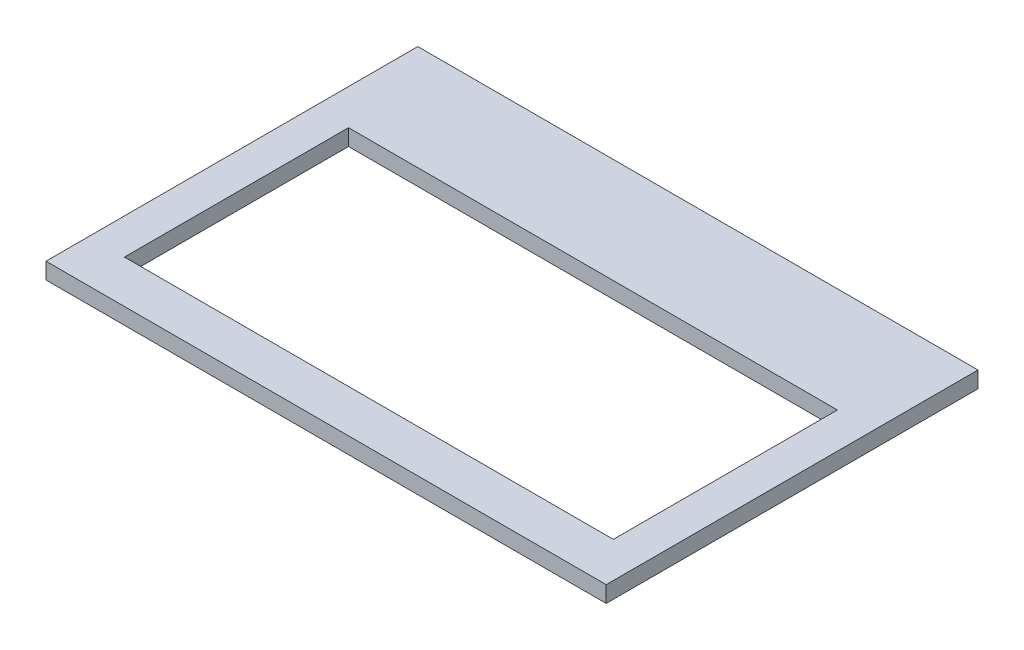
ISO-10303-21;
HEADER;
FILE_DESCRIPTION(('STEP AP214'),'2;1');
FILE_NAME('part.step','',(''),(''),'','','');
FILE_SCHEMA(('AUTOMOTIVE_DESIGN { 1 0 10303 214 1 1 1 1 }'));
ENDSEC;
DATA;
#1=APPLICATION_CONTEXT('core data for automotive mechanical design processes');
#2=APPLICATION_PROTOCOL_DEFINITION('international standard','automotive_design',2000,#1);
#3=PRODUCT_CONTEXT('',#1,'mechanical');
#4=PRODUCT('Part','Part','',(#3));
#5=PRODUCT_RELATED_PRODUCT_CATEGORY('part','',(#4));
#6=PRODUCT_DEFINITION_FORMATION('','',#4);
#7=PRODUCT_DEFINITION_CONTEXT('part definition',#1,'design');
#8=PRODUCT_DEFINITION('design','',#6,#7);
#9=PRODUCT_DEFINITION_SHAPE('','',#8);
#10=(LENGTH_UNIT() NAMED_UNIT(*) SI_UNIT(.MILLI.,.METRE.));
#11=(NAMED_UNIT(*) PLANE_ANGLE_UNIT() SI_UNIT($,.RADIAN.));
#12=(NAMED_UNIT(*) SI_UNIT($,.STERADIAN.) SOLID_ANGLE_UNIT());
#13=UNCERTAINTY_MEASURE_WITH_UNIT(LENGTH_MEASURE(1.E-05),#10,'distance_accuracy_value','');
#14=(GEOMETRIC_REPRESENTATION_CONTEXT(3) GLOBAL_UNCERTAINTY_ASSIGNED_CONTEXT((#13)) GLOBAL_UNIT_ASSIGNED_CONTEXT((#10,
#11,#12)) REPRESENTATION_CONTEXT('',''));
#15=CARTESIAN_POINT('',(0.,0.,0.));
#16=DIRECTION('',(0.,0.,1.));
#17=DIRECTION('',(1.,0.,0.));
#18=AXIS2_PLACEMENT_3D('',#15,#16,#17);
#19=CARTESIAN_POINT('',(275.,16.,182.5));
#20=DIRECTION('',(-1.,0.,0.));
#21=DIRECTION('',(0.,0.,1.));
#22=AXIS2_PLACEMENT_3D('',#19,#20,#21);
#23=PLANE('',#22);
#24=DIRECTION('',(0.,0.,-1.));
#25=VECTOR('',#24,1.);
#26=CARTESIAN_POINT('',(275.,0.,182.5));
#27=LINE('',#26,#25);
#28=CARTESIAN_POINT('',(275.,0.,182.5));
#29=VERTEX_POINT('',#28);
#30=CARTESIAN_POINT('',(275.,0.,-182.5));
#31=VERTEX_POINT('',#30);
#32=EDGE_CURVE('E129',#29,#31,#27,.T.);
#33=ORIENTED_EDGE('',*,*,#32,.T.);
#34=DIRECTION('',(0.,-1.,0.));
#35=VECTOR('',#34,1.);
#36=CARTESIAN_POINT('',(275.,16.,-182.5));
#37=LINE('',#36,#35);
#38=CARTESIAN_POINT('',(275.,16.,-182.5));
#39=VERTEX_POINT('',#38);
#40=EDGE_CURVE('E11',#39,#31,#37,.T.);
#41=ORIENTED_EDGE('',*,*,#40,.F.);
#42=DIRECTION('',(0.,0.,-1.));
#43=VECTOR('',#42,1.);
#44=CARTESIAN_POINT('',(275.,16.,182.5));
#45=LINE('',#44,#43);
#46=CARTESIAN_POINT('',(275.,16.,182.5));
#47=VERTEX_POINT('',#46);
#48=EDGE_CURVE('E133',#47,#39,#45,.T.);
#49=ORIENTED_EDGE('',*,*,#48,.F.);
#50=DIRECTION('',(0.,-1.,0.));
#51=VECTOR('',#50,1.);
#52=CARTESIAN_POINT('',(275.,16.,182.5));
#53=LINE('',#52,#51);
#54=EDGE_CURVE('E143',#47,#29,#53,.T.);
#55=ORIENTED_EDGE('',*,*,#54,.T.);
#56=EDGE_LOOP('',(#33,#41,#49,#55));
#57=FACE_BOUND('',#56,.T.);
#58=ADVANCED_FACE('F32',(#57),#23,.F.);
#59=CARTESIAN_POINT('',(-275.,16.,-182.5));
#60=DIRECTION('',(0.,0.,1.));
#61=DIRECTION('',(1.,0.,0.));
#62=AXIS2_PLACEMENT_3D('',#59,#60,#61);
#63=PLANE('',#62);
#64=DIRECTION('',(-1.,0.,0.));
#65=VECTOR('',#64,1.);
#66=CARTESIAN_POINT('',(-275.,0.,-182.5));
#67=LINE('',#66,#65);
#68=CARTESIAN_POINT('',(-275.,0.,-182.5));
#69=VERTEX_POINT('',#68);
#70=EDGE_CURVE('E146',#31,#69,#67,.T.);
#71=ORIENTED_EDGE('',*,*,#70,.T.);
#72=DIRECTION('',(0.,-1.,0.));
#73=VECTOR('',#72,1.);
#74=CARTESIAN_POINT('',(-275.,16.,-182.5));
#75=LINE('',#74,#73);
#76=CARTESIAN_POINT('',(-275.,16.,-182.5));
#77=VERTEX_POINT('',#76);
#78=EDGE_CURVE('E39',#77,#69,#75,.T.);
#79=ORIENTED_EDGE('',*,*,#78,.F.);
#80=DIRECTION('',(-1.,0.,0.));
#81=VECTOR('',#80,1.);
#82=CARTESIAN_POINT('',(-275.,16.,-182.5));
#83=LINE('',#82,#81);
#84=EDGE_CURVE('E136',#39,#77,#83,.T.);
#85=ORIENTED_EDGE('',*,*,#84,.F.);
#86=ORIENTED_EDGE('',*,*,#40,.T.);
#87=EDGE_LOOP('',(#71,#79,#85,#86));
#88=FACE_BOUND('',#87,.T.);
#89=ADVANCED_FACE('F174',(#88),#63,.F.);
#90=CARTESIAN_POINT('',(-275.,16.,182.5));
#91=DIRECTION('',(1.,0.,0.));
#92=DIRECTION('',(0.,0.,-1.));
#93=AXIS2_PLACEMENT_3D('',#90,#91,#92);
#94=PLANE('',#93);
#95=DIRECTION('',(0.,0.,1.));
#96=VECTOR('',#95,1.);
#97=CARTESIAN_POINT('',(-275.,0.,182.5));
#98=LINE('',#97,#96);
#99=CARTESIAN_POINT('',(-275.,0.,182.5));
#100=VERTEX_POINT('',#99);
#101=EDGE_CURVE('E148',#69,#100,#98,.T.);
#102=ORIENTED_EDGE('',*,*,#101,.T.);
#103=DIRECTION('',(0.,-1.,0.));
#104=VECTOR('',#103,1.);
#105=CARTESIAN_POINT('',(-275.,16.,182.5));
#106=LINE('',#105,#104);
#107=CARTESIAN_POINT('',(-275.,16.,182.5));
#108=VERTEX_POINT('',#107);
#109=EDGE_CURVE('E153',#108,#100,#106,.T.);
#110=ORIENTED_EDGE('',*,*,#109,.F.);
#111=DIRECTION('',(0.,0.,1.));
#112=VECTOR('',#111,1.);
#113=CARTESIAN_POINT('',(-275.,16.,182.5));
#114=LINE('',#113,#112);
#115=EDGE_CURVE('E139',#77,#108,#114,.T.);
#116=ORIENTED_EDGE('',*,*,#115,.F.);
#117=ORIENTED_EDGE('',*,*,#78,.T.);
#118=EDGE_LOOP('',(#102,#110,#116,#117));
#119=FACE_BOUND('',#118,.T.);
#120=ADVANCED_FACE('F160',(#119),#94,.F.);
#121=CARTESIAN_POINT('',(-275.,16.,182.5));
#122=DIRECTION('',(0.,0.,-1.));
#123=DIRECTION('',(-1.,0.,0.));
#124=AXIS2_PLACEMENT_3D('',#121,#122,#123);
#125=PLANE('',#124);
#126=DIRECTION('',(1.,0.,0.));
#127=VECTOR('',#126,1.);
#128=CARTESIAN_POINT('',(-275.,0.,182.5));
#129=LINE('',#128,#127);
#130=EDGE_CURVE('E137',#100,#29,#129,.T.);
#131=ORIENTED_EDGE('',*,*,#130,.T.);
#132=ORIENTED_EDGE('',*,*,#54,.F.);
#133=DIRECTION('',(1.,0.,0.));
#134=VECTOR('',#133,1.);
#135=CARTESIAN_POINT('',(-275.,16.,182.5));
#136=LINE('',#135,#134);
#137=EDGE_CURVE('E141',#108,#47,#136,.T.);
#138=ORIENTED_EDGE('',*,*,#137,.F.);
#139=ORIENTED_EDGE('',*,*,#109,.T.);
#140=EDGE_LOOP('',(#131,#132,#138,#139));
#141=FACE_BOUND('',#140,.T.);
#142=ADVANCED_FACE('F167',(#141),#125,.F.);
#143=CARTESIAN_POINT('',(0.,16.,0.));
#144=DIRECTION('',(0.,-1.,0.));
#145=DIRECTION('',(0.,0.,-1.));
#146=AXIS2_PLACEMENT_3D('',#143,#144,#145);
#147=PLANE('',#146);
#148=DIRECTION('',(1.,0.,0.));
#149=VECTOR('',#148,1.);
#150=CARTESIAN_POINT('',(-240.,16.,140.5));
#151=LINE('',#150,#149);
#152=CARTESIAN_POINT('',(-240.,16.,140.5));
#153=VERTEX_POINT('',#152);
#154=CARTESIAN_POINT('',(240.,16.,140.5));
#155=VERTEX_POINT('',#154);
#156=EDGE_CURVE('E123',#153,#155,#151,.T.);
#157=ORIENTED_EDGE('',*,*,#156,.F.);
#158=DIRECTION('',(0.,0.,1.));
#159=VECTOR('',#158,1.);
#160=CARTESIAN_POINT('',(-240.,16.,-79.4999999999997));
#161=LINE('',#160,#159);
#162=CARTESIAN_POINT('',(-240.,16.,-79.4999999999997));
#163=VERTEX_POINT('',#162);
#164=EDGE_CURVE('E46',#163,#153,#161,.T.);
#165=ORIENTED_EDGE('',*,*,#164,.F.);
#166=DIRECTION('',(-1.,0.,0.));
#167=VECTOR('',#166,1.);
#168=CARTESIAN_POINT('',(-240.,16.,-79.4999999999997));
#169=LINE('',#168,#167);
#170=CARTESIAN_POINT('',(240.,16.,-79.5));
#171=VERTEX_POINT('',#170);
#172=EDGE_CURVE('E114',#171,#163,#169,.T.);
#173=ORIENTED_EDGE('',*,*,#172,.F.);
#174=DIRECTION('',(0.,0.,-1.));
#175=VECTOR('',#174,1.);
#176=CARTESIAN_POINT('',(240.,16.,-79.5));
#177=LINE('',#176,#175);
#178=EDGE_CURVE('E117',#155,#171,#177,.T.);
#179=ORIENTED_EDGE('',*,*,#178,.F.);
#180=EDGE_LOOP('',(#157,#165,#173,#179));
#181=FACE_BOUND('',#180,.T.);
#182=ORIENTED_EDGE('',*,*,#48,.T.);
#183=ORIENTED_EDGE('',*,*,#84,.T.);
#184=ORIENTED_EDGE('',*,*,#115,.T.);
#185=ORIENTED_EDGE('',*,*,#137,.T.);
#186=EDGE_LOOP('',(#182,#183,#184,#185));
#187=FACE_BOUND('',#186,.T.);
#188=ADVANCED_FACE('F173',(#181,#187),#147,.F.);
#189=CARTESIAN_POINT('',(0.,0.,0.));
#190=DIRECTION('',(0.,-1.,0.));
#191=DIRECTION('',(0.,0.,-1.));
#192=AXIS2_PLACEMENT_3D('',#189,#190,#191);
#193=PLANE('',#192);
#194=DIRECTION('',(0.,0.,1.));
#195=VECTOR('',#194,1.);
#196=CARTESIAN_POINT('',(-240.,0.,-79.4999999999997));
#197=LINE('',#196,#195);
#198=CARTESIAN_POINT('',(-240.,0.,-79.4999999999997));
#199=VERTEX_POINT('',#198);
#200=CARTESIAN_POINT('',(-240.,0.,140.5));
#201=VERTEX_POINT('',#200);
#202=EDGE_CURVE('E98',#199,#201,#197,.T.);
#203=ORIENTED_EDGE('',*,*,#202,.T.);
#204=DIRECTION('',(1.,0.,0.));
#205=VECTOR('',#204,1.);
#206=CARTESIAN_POINT('',(-240.,0.,140.5));
#207=LINE('',#206,#205);
#208=CARTESIAN_POINT('',(240.,0.,140.5));
#209=VERTEX_POINT('',#208);
#210=EDGE_CURVE('E107',#201,#209,#207,.T.);
#211=ORIENTED_EDGE('',*,*,#210,.T.);
#212=DIRECTION('',(0.,0.,-1.));
#213=VECTOR('',#212,1.);
#214=CARTESIAN_POINT('',(240.,0.,-79.5));
#215=LINE('',#214,#213);
#216=CARTESIAN_POINT('',(240.,0.,-79.5));
#217=VERTEX_POINT('',#216);
#218=EDGE_CURVE('E54',#209,#217,#215,.T.);
#219=ORIENTED_EDGE('',*,*,#218,.T.);
#220=DIRECTION('',(-1.,0.,0.));
#221=VECTOR('',#220,1.);
#222=CARTESIAN_POINT('',(-240.,0.,-79.4999999999997));
#223=LINE('',#222,#221);
#224=EDGE_CURVE('E104',#217,#199,#223,.T.);
#225=ORIENTED_EDGE('',*,*,#224,.T.);
#226=EDGE_LOOP('',(#203,#211,#219,#225));
#227=FACE_BOUND('',#226,.T.);
#228=ORIENTED_EDGE('',*,*,#32,.F.);
#229=ORIENTED_EDGE('',*,*,#130,.F.);
#230=ORIENTED_EDGE('',*,*,#101,.F.);
#231=ORIENTED_EDGE('',*,*,#70,.F.);
#232=EDGE_LOOP('',(#228,#229,#230,#231));
#233=FACE_BOUND('',#232,.T.);
#234=ADVANCED_FACE('F111',(#227,#233),#193,.T.);
#235=CARTESIAN_POINT('',(-240.,0.,-79.4999999999997));
#236=DIRECTION('',(-1.,0.,0.));
#237=DIRECTION('',(0.,0.,1.));
#238=AXIS2_PLACEMENT_3D('',#235,#236,#237);
#239=PLANE('',#238);
#240=ORIENTED_EDGE('',*,*,#164,.T.);
#241=DIRECTION('',(0.,1.,0.));
#242=VECTOR('',#241,1.);
#243=CARTESIAN_POINT('',(-240.,0.,140.5));
#244=LINE('',#243,#242);
#245=EDGE_CURVE('E94',#201,#153,#244,.T.);
#246=ORIENTED_EDGE('',*,*,#245,.F.);
#247=ORIENTED_EDGE('',*,*,#202,.F.);
#248=DIRECTION('',(0.,1.,0.));
#249=VECTOR('',#248,1.);
#250=CARTESIAN_POINT('',(-240.,0.,-79.4999999999997));
#251=LINE('',#250,#249);
#252=EDGE_CURVE('E127',#199,#163,#251,.T.);
#253=ORIENTED_EDGE('',*,*,#252,.T.);
#254=EDGE_LOOP('',(#240,#246,#247,#253));
#255=FACE_BOUND('',#254,.T.);
#256=ADVANCED_FACE('F96',(#255),#239,.F.);
#257=CARTESIAN_POINT('',(-240.,0.,-79.4999999999997));
#258=DIRECTION('',(0.,0.,-1.));
#259=DIRECTION('',(-1.,0.,0.));
#260=AXIS2_PLACEMENT_3D('',#257,#258,#259);
#261=PLANE('',#260);
#262=ORIENTED_EDGE('',*,*,#172,.T.);
#263=ORIENTED_EDGE('',*,*,#252,.F.);
#264=ORIENTED_EDGE('',*,*,#224,.F.);
#265=DIRECTION('',(0.,1.,0.));
#266=VECTOR('',#265,1.);
#267=CARTESIAN_POINT('',(240.,0.,-79.5));
#268=LINE('',#267,#266);
#269=EDGE_CURVE('E130',#217,#171,#268,.T.);
#270=ORIENTED_EDGE('',*,*,#269,.T.);
#271=EDGE_LOOP('',(#262,#263,#264,#270));
#272=FACE_BOUND('',#271,.T.);
#273=ADVANCED_FACE('F191',(#272),#261,.F.);
#274=CARTESIAN_POINT('',(240.,0.,-79.5));
#275=DIRECTION('',(1.,0.,0.));
#276=DIRECTION('',(0.,0.,-1.));
#277=AXIS2_PLACEMENT_3D('',#274,#275,#276);
#278=PLANE('',#277);
#279=ORIENTED_EDGE('',*,*,#178,.T.);
#280=ORIENTED_EDGE('',*,*,#269,.F.);
#281=ORIENTED_EDGE('',*,*,#218,.F.);
#282=DIRECTION('',(0.,1.,0.));
#283=VECTOR('',#282,1.);
#284=CARTESIAN_POINT('',(240.,0.,140.5));
#285=LINE('',#284,#283);
#286=EDGE_CURVE('E103',#209,#155,#285,.T.);
#287=ORIENTED_EDGE('',*,*,#286,.T.);
#288=EDGE_LOOP('',(#279,#280,#281,#287));
#289=FACE_BOUND('',#288,.T.);
#290=ADVANCED_FACE('F194',(#289),#278,.F.);
#291=CARTESIAN_POINT('',(-240.,0.,140.5));
#292=DIRECTION('',(0.,0.,1.));
#293=DIRECTION('',(1.,0.,0.));
#294=AXIS2_PLACEMENT_3D('',#291,#292,#293);
#295=PLANE('',#294);
#296=ORIENTED_EDGE('',*,*,#156,.T.);
#297=ORIENTED_EDGE('',*,*,#286,.F.);
#298=ORIENTED_EDGE('',*,*,#210,.F.);
#299=ORIENTED_EDGE('',*,*,#245,.T.);
#300=EDGE_LOOP('',(#296,#297,#298,#299));
#301=FACE_BOUND('',#300,.T.);
#302=ADVANCED_FACE('F108',(#301),#295,.F.);
#303=CLOSED_SHELL('',(#58,#89,#120,#142,#188,#234,#256,#273,#290,#302));
#304=MANIFOLD_SOLID_BREP('B2',#303);
#305=ADVANCED_BREP_SHAPE_REPRESENTATION('',(#18,#304),#14);
#306=SHAPE_DEFINITION_REPRESENTATION(#9,#305);
ENDSEC;
END-ISO-10303-21;
